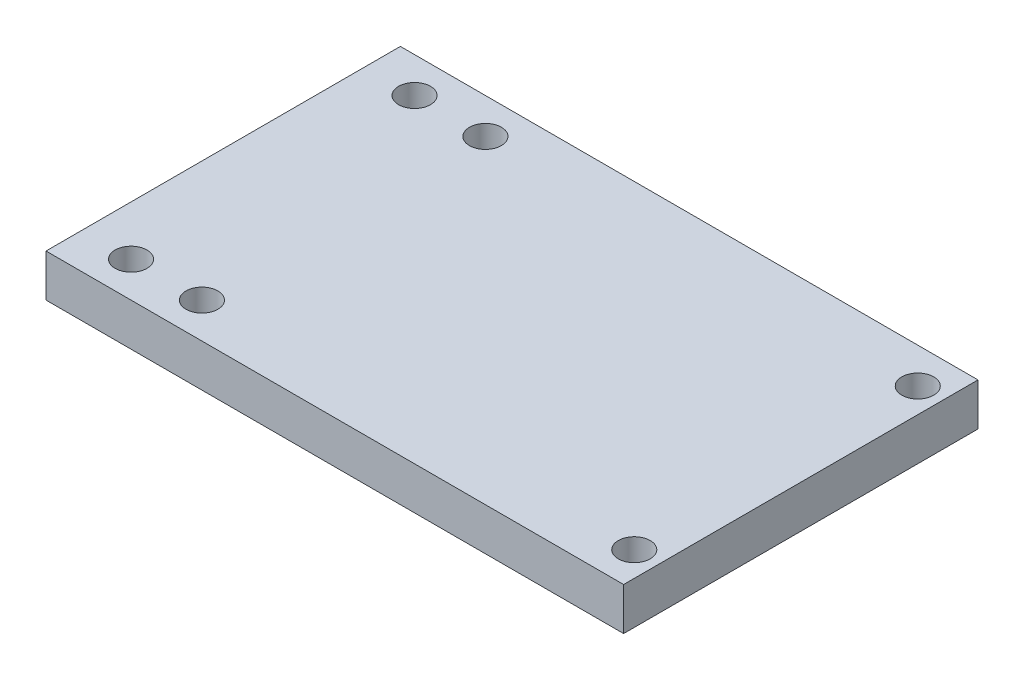
ISO-10303-21;
HEADER;
FILE_DESCRIPTION(('STEP AP214'),'2;1');
FILE_NAME('part.step','',(''),(''),'','','');
FILE_SCHEMA(('AUTOMOTIVE_DESIGN { 1 0 10303 214 1 1 1 1 }'));
ENDSEC;
DATA;
#1=APPLICATION_CONTEXT('core data for automotive mechanical design processes');
#2=APPLICATION_PROTOCOL_DEFINITION('international standard','automotive_design',2000,#1);
#3=PRODUCT_CONTEXT('',#1,'mechanical');
#4=PRODUCT('Part','Part','',(#3));
#5=PRODUCT_RELATED_PRODUCT_CATEGORY('part','',(#4));
#6=PRODUCT_DEFINITION_FORMATION('','',#4);
#7=PRODUCT_DEFINITION_CONTEXT('part definition',#1,'design');
#8=PRODUCT_DEFINITION('design','',#6,#7);
#9=PRODUCT_DEFINITION_SHAPE('','',#8);
#10=(LENGTH_UNIT() NAMED_UNIT(*) SI_UNIT(.MILLI.,.METRE.));
#11=(NAMED_UNIT(*) PLANE_ANGLE_UNIT() SI_UNIT($,.RADIAN.));
#12=(NAMED_UNIT(*) SI_UNIT($,.STERADIAN.) SOLID_ANGLE_UNIT());
#13=UNCERTAINTY_MEASURE_WITH_UNIT(LENGTH_MEASURE(1.E-05),#10,'distance_accuracy_value','');
#14=(GEOMETRIC_REPRESENTATION_CONTEXT(3) GLOBAL_UNCERTAINTY_ASSIGNED_CONTEXT((#13)) GLOBAL_UNIT_ASSIGNED_CONTEXT((#10,
#11,#12)) REPRESENTATION_CONTEXT('',''));
#15=CARTESIAN_POINT('',(0.,0.,0.));
#16=DIRECTION('',(0.,0.,1.));
#17=DIRECTION('',(1.,0.,0.));
#18=AXIS2_PLACEMENT_3D('',#15,#16,#17);
#19=CARTESIAN_POINT('',(0.,0.001600000000053,50.000049774017));
#20=DIRECTION('',(0.,1.,0.));
#21=DIRECTION('',(0.,0.,1.));
#22=AXIS2_PLACEMENT_3D('',#19,#20,#21);
#23=PLANE('',#22);
#24=CARTESIAN_POINT('',(78.,0.001600000000053,5.000049774017));
#25=DIRECTION('',(0.,1.,0.));
#26=DIRECTION('',(0.,0.,1.));
#27=AXIS2_PLACEMENT_3D('',#24,#25,#26);
#28=CIRCLE('',#27,2.25);
#29=CARTESIAN_POINT('',(78.,0.001600000000053,7.250049774017));
#30=VERTEX_POINT('',#29);
#31=EDGE_CURVE('E96',#30,#30,#28,.T.);
#32=ORIENTED_EDGE('',*,*,#31,.T.);
#33=EDGE_LOOP('',(#32));
#34=FACE_BOUND('',#33,.T.);
#35=CARTESIAN_POINT('',(17.,0.001600000000053,5.000049774017));
#36=DIRECTION('',(0.,1.,0.));
#37=DIRECTION('',(0.,0.,1.));
#38=AXIS2_PLACEMENT_3D('',#35,#36,#37);
#39=CIRCLE('',#38,2.25);
#40=CARTESIAN_POINT('',(17.,0.001600000000053,7.250049774017));
#41=VERTEX_POINT('',#40);
#42=EDGE_CURVE('E100',#41,#41,#39,.T.);
#43=ORIENTED_EDGE('',*,*,#42,.T.);
#44=EDGE_LOOP('',(#43));
#45=FACE_BOUND('',#44,.T.);
#46=CARTESIAN_POINT('',(7.,0.001600000000053,5.000049774017));
#47=DIRECTION('',(0.,1.,0.));
#48=DIRECTION('',(0.,0.,1.));
#49=AXIS2_PLACEMENT_3D('',#46,#47,#48);
#50=CIRCLE('',#49,2.25);
#51=CARTESIAN_POINT('',(7.,0.001600000000053,7.250049774017));
#52=VERTEX_POINT('',#51);
#53=EDGE_CURVE('E103',#52,#52,#50,.T.);
#54=ORIENTED_EDGE('',*,*,#53,.T.);
#55=EDGE_LOOP('',(#54));
#56=FACE_BOUND('',#55,.T.);
#57=CARTESIAN_POINT('',(78.,0.001600000000053,45.000049774017));
#58=DIRECTION('',(0.,1.,0.));
#59=DIRECTION('',(0.,0.,1.));
#60=AXIS2_PLACEMENT_3D('',#57,#58,#59);
#61=CIRCLE('',#60,2.25);
#62=CARTESIAN_POINT('',(78.,0.001600000000053,47.250049774017));
#63=VERTEX_POINT('',#62);
#64=EDGE_CURVE('E106',#63,#63,#61,.T.);
#65=ORIENTED_EDGE('',*,*,#64,.T.);
#66=EDGE_LOOP('',(#65));
#67=FACE_BOUND('',#66,.T.);
#68=CARTESIAN_POINT('',(17.,0.001600000000053,45.000049774017));
#69=DIRECTION('',(0.,1.,0.));
#70=DIRECTION('',(0.,0.,1.));
#71=AXIS2_PLACEMENT_3D('',#68,#69,#70);
#72=CIRCLE('',#71,2.25);
#73=CARTESIAN_POINT('',(17.,0.001600000000053,47.250049774017));
#74=VERTEX_POINT('',#73);
#75=EDGE_CURVE('E108',#74,#74,#72,.T.);
#76=ORIENTED_EDGE('',*,*,#75,.T.);
#77=EDGE_LOOP('',(#76));
#78=FACE_BOUND('',#77,.T.);
#79=CARTESIAN_POINT('',(7.,0.001600000000053,45.000049774017));
#80=DIRECTION('',(0.,1.,0.));
#81=DIRECTION('',(0.,0.,1.));
#82=AXIS2_PLACEMENT_3D('',#79,#80,#81);
#83=CIRCLE('',#82,2.25);
#84=CARTESIAN_POINT('',(7.,0.001600000000053,47.250049774017));
#85=VERTEX_POINT('',#84);
#86=EDGE_CURVE('E19',#85,#85,#83,.T.);
#87=ORIENTED_EDGE('',*,*,#86,.T.);
#88=EDGE_LOOP('',(#87));
#89=FACE_BOUND('',#88,.T.);
#90=DIRECTION('',(0.,0.,-1.));
#91=VECTOR('',#90,1.);
#92=CARTESIAN_POINT('',(81.5,0.001600000000053,50.000049774017));
#93=LINE('',#92,#91);
#94=CARTESIAN_POINT('',(81.5,0.001600000000053,50.000049774017));
#95=VERTEX_POINT('',#94);
#96=CARTESIAN_POINT('',(81.5,0.001600000000053,4.97740165887595E-05));
#97=VERTEX_POINT('',#96);
#98=EDGE_CURVE('E61',#95,#97,#93,.T.);
#99=ORIENTED_EDGE('',*,*,#98,.F.);
#100=DIRECTION('',(-1.,0.,0.));
#101=VECTOR('',#100,1.);
#102=CARTESIAN_POINT('',(0.,0.001600000000053,50.000049774017));
#103=LINE('',#102,#101);
#104=CARTESIAN_POINT('',(0.,0.001600000000053,50.000049774017));
#105=VERTEX_POINT('',#104);
#106=EDGE_CURVE('E55',#95,#105,#103,.T.);
#107=ORIENTED_EDGE('',*,*,#106,.T.);
#108=DIRECTION('',(0.,0.,-1.));
#109=VECTOR('',#108,1.);
#110=CARTESIAN_POINT('',(0.,0.001600000000053,50.000049774017));
#111=LINE('',#110,#109);
#112=CARTESIAN_POINT('',(0.,0.001600000000053,4.97740165887595E-05));
#113=VERTEX_POINT('',#112);
#114=EDGE_CURVE('E59',#105,#113,#111,.T.);
#115=ORIENTED_EDGE('',*,*,#114,.T.);
#116=DIRECTION('',(-1.,0.,0.));
#117=VECTOR('',#116,1.);
#118=CARTESIAN_POINT('',(0.,0.001600000000053,4.977401658834E-05));
#119=LINE('',#118,#117);
#120=EDGE_CURVE('E117',#97,#113,#119,.T.);
#121=ORIENTED_EDGE('',*,*,#120,.F.);
#122=EDGE_LOOP('',(#99,#107,#115,#121));
#123=FACE_BOUND('',#122,.T.);
#124=ADVANCED_FACE('F16',(#34,#45,#56,#67,#78,#89,#123),#23,.F.);
#125=CARTESIAN_POINT('',(0.,0.001600000000053,50.000049774017));
#126=DIRECTION('',(1.,0.,0.));
#127=DIRECTION('',(0.,0.,-1.));
#128=AXIS2_PLACEMENT_3D('',#125,#126,#127);
#129=PLANE('',#128);
#130=DIRECTION('',(0.,1.,0.));
#131=VECTOR('',#130,1.);
#132=CARTESIAN_POINT('',(0.,0.001600000000053,4.977401658834E-05));
#133=LINE('',#132,#131);
#134=CARTESIAN_POINT('',(0.,6.0016,4.97740165887595E-05));
#135=VERTEX_POINT('',#134);
#136=EDGE_CURVE('E69',#113,#135,#133,.T.);
#137=ORIENTED_EDGE('',*,*,#136,.F.);
#138=ORIENTED_EDGE('',*,*,#114,.F.);
#139=DIRECTION('',(0.,1.,0.));
#140=VECTOR('',#139,1.);
#141=CARTESIAN_POINT('',(0.,0.001600000000053,50.000049774017));
#142=LINE('',#141,#140);
#143=CARTESIAN_POINT('',(0.,6.0016,50.000049774017));
#144=VERTEX_POINT('',#143);
#145=EDGE_CURVE('E63',#105,#144,#142,.T.);
#146=ORIENTED_EDGE('',*,*,#145,.T.);
#147=DIRECTION('',(0.,0.,1.));
#148=VECTOR('',#147,1.);
#149=CARTESIAN_POINT('',(0.,6.0016,50.000049774017));
#150=LINE('',#149,#148);
#151=EDGE_CURVE('E99',#135,#144,#150,.T.);
#152=ORIENTED_EDGE('',*,*,#151,.F.);
#153=EDGE_LOOP('',(#137,#138,#146,#152));
#154=FACE_BOUND('',#153,.T.);
#155=ADVANCED_FACE('F66',(#154),#129,.F.);
#156=CARTESIAN_POINT('',(0.,0.001600000000053,50.000049774017));
#157=DIRECTION('',(0.,0.,-1.));
#158=DIRECTION('',(-1.,0.,0.));
#159=AXIS2_PLACEMENT_3D('',#156,#157,#158);
#160=PLANE('',#159);
#161=DIRECTION('',(1.,0.,0.));
#162=VECTOR('',#161,1.);
#163=CARTESIAN_POINT('',(0.,6.0016,50.000049774017));
#164=LINE('',#163,#162);
#165=CARTESIAN_POINT('',(81.5,6.0016,50.000049774017));
#166=VERTEX_POINT('',#165);
#167=EDGE_CURVE('E74',#144,#166,#164,.T.);
#168=ORIENTED_EDGE('',*,*,#167,.F.);
#169=ORIENTED_EDGE('',*,*,#145,.F.);
#170=ORIENTED_EDGE('',*,*,#106,.F.);
#171=DIRECTION('',(0.,1.,0.));
#172=VECTOR('',#171,1.);
#173=CARTESIAN_POINT('',(81.5,0.001600000000053,50.000049774017));
#174=LINE('',#173,#172);
#175=EDGE_CURVE('E76',#166,#95,#174,.F.);
#176=ORIENTED_EDGE('',*,*,#175,.F.);
#177=EDGE_LOOP('',(#168,#169,#170,#176));
#178=FACE_BOUND('',#177,.T.);
#179=ADVANCED_FACE('F72',(#178),#160,.F.);
#180=CARTESIAN_POINT('',(81.5,0.001600000000053,50.000049774017));
#181=DIRECTION('',(1.,0.,0.));
#182=DIRECTION('',(0.,0.,-1.));
#183=AXIS2_PLACEMENT_3D('',#180,#181,#182);
#184=PLANE('',#183);
#185=DIRECTION('',(0.,1.,0.));
#186=VECTOR('',#185,1.);
#187=CARTESIAN_POINT('',(81.5,0.001600000000053,4.977401658834E-05));
#188=LINE('',#187,#186);
#189=CARTESIAN_POINT('',(81.5,6.0016,4.97740165887595E-05));
#190=VERTEX_POINT('',#189);
#191=EDGE_CURVE('E34',#190,#97,#188,.F.);
#192=ORIENTED_EDGE('',*,*,#191,.F.);
#193=DIRECTION('',(0.,0.,1.));
#194=VECTOR('',#193,1.);
#195=CARTESIAN_POINT('',(81.5,6.0016,50.000049774017));
#196=LINE('',#195,#194);
#197=EDGE_CURVE('E124',#166,#190,#196,.F.);
#198=ORIENTED_EDGE('',*,*,#197,.F.);
#199=ORIENTED_EDGE('',*,*,#175,.T.);
#200=ORIENTED_EDGE('',*,*,#98,.T.);
#201=EDGE_LOOP('',(#192,#198,#199,#200));
#202=FACE_BOUND('',#201,.T.);
#203=ADVANCED_FACE('F122',(#202),#184,.T.);
#204=CARTESIAN_POINT('',(0.,0.001600000000053,4.977401658834E-05));
#205=DIRECTION('',(0.,0.,-1.));
#206=DIRECTION('',(-1.,0.,0.));
#207=AXIS2_PLACEMENT_3D('',#204,#205,#206);
#208=PLANE('',#207);
#209=DIRECTION('',(1.,0.,0.));
#210=VECTOR('',#209,1.);
#211=CARTESIAN_POINT('',(0.,6.0016,4.97740165888994E-05));
#212=LINE('',#211,#210);
#213=EDGE_CURVE('E95',#190,#135,#212,.F.);
#214=ORIENTED_EDGE('',*,*,#213,.F.);
#215=ORIENTED_EDGE('',*,*,#191,.T.);
#216=ORIENTED_EDGE('',*,*,#120,.T.);
#217=ORIENTED_EDGE('',*,*,#136,.T.);
#218=EDGE_LOOP('',(#214,#215,#216,#217));
#219=FACE_BOUND('',#218,.T.);
#220=ADVANCED_FACE('F130',(#219),#208,.T.);
#221=CARTESIAN_POINT('',(7.,0.001600000000053,45.000049774017));
#222=DIRECTION('',(0.,1.,0.));
#223=DIRECTION('',(0.,0.,1.));
#224=AXIS2_PLACEMENT_3D('',#221,#222,#223);
#225=CYLINDRICAL_SURFACE('',#224,2.25);
#226=ORIENTED_EDGE('',*,*,#86,.F.);
#227=EDGE_LOOP('',(#226));
#228=FACE_BOUND('',#227,.T.);
#229=CARTESIAN_POINT('',(7.,6.0016,45.000049774017));
#230=DIRECTION('',(0.,1.,0.));
#231=DIRECTION('',(0.,0.,1.));
#232=AXIS2_PLACEMENT_3D('',#229,#230,#231);
#233=CIRCLE('',#232,2.25);
#234=CARTESIAN_POINT('',(7.,6.0016,47.250049774017));
#235=VERTEX_POINT('',#234);
#236=EDGE_CURVE('E92',#235,#235,#233,.F.);
#237=ORIENTED_EDGE('',*,*,#236,.F.);
#238=EDGE_LOOP('',(#237));
#239=FACE_BOUND('',#238,.T.);
#240=ADVANCED_FACE('F132',(#228,#239),#225,.F.);
#241=CARTESIAN_POINT('',(17.,0.001600000000053,45.000049774017));
#242=DIRECTION('',(0.,1.,0.));
#243=DIRECTION('',(0.,0.,1.));
#244=AXIS2_PLACEMENT_3D('',#241,#242,#243);
#245=CYLINDRICAL_SURFACE('',#244,2.25);
#246=ORIENTED_EDGE('',*,*,#75,.F.);
#247=EDGE_LOOP('',(#246));
#248=FACE_BOUND('',#247,.T.);
#249=CARTESIAN_POINT('',(17.,6.0016,45.000049774017));
#250=DIRECTION('',(0.,1.,0.));
#251=DIRECTION('',(0.,0.,1.));
#252=AXIS2_PLACEMENT_3D('',#249,#250,#251);
#253=CIRCLE('',#252,2.25);
#254=CARTESIAN_POINT('',(17.,6.0016,47.250049774017));
#255=VERTEX_POINT('',#254);
#256=EDGE_CURVE('E89',#255,#255,#253,.F.);
#257=ORIENTED_EDGE('',*,*,#256,.F.);
#258=EDGE_LOOP('',(#257));
#259=FACE_BOUND('',#258,.T.);
#260=ADVANCED_FACE('F139',(#248,#259),#245,.F.);
#261=CARTESIAN_POINT('',(78.,0.001600000000053,45.000049774017));
#262=DIRECTION('',(0.,1.,0.));
#263=DIRECTION('',(0.,0.,1.));
#264=AXIS2_PLACEMENT_3D('',#261,#262,#263);
#265=CYLINDRICAL_SURFACE('',#264,2.25);
#266=ORIENTED_EDGE('',*,*,#64,.F.);
#267=EDGE_LOOP('',(#266));
#268=FACE_BOUND('',#267,.T.);
#269=CARTESIAN_POINT('',(78.,6.0016,45.000049774017));
#270=DIRECTION('',(0.,1.,0.));
#271=DIRECTION('',(0.,0.,1.));
#272=AXIS2_PLACEMENT_3D('',#269,#270,#271);
#273=CIRCLE('',#272,2.25);
#274=CARTESIAN_POINT('',(78.,6.0016,47.250049774017));
#275=VERTEX_POINT('',#274);
#276=EDGE_CURVE('E86',#275,#275,#273,.F.);
#277=ORIENTED_EDGE('',*,*,#276,.F.);
#278=EDGE_LOOP('',(#277));
#279=FACE_BOUND('',#278,.T.);
#280=ADVANCED_FACE('F161',(#268,#279),#265,.F.);
#281=CARTESIAN_POINT('',(7.,0.001600000000053,5.000049774017));
#282=DIRECTION('',(0.,1.,0.));
#283=DIRECTION('',(0.,0.,1.));
#284=AXIS2_PLACEMENT_3D('',#281,#282,#283);
#285=CYLINDRICAL_SURFACE('',#284,2.25);
#286=ORIENTED_EDGE('',*,*,#53,.F.);
#287=EDGE_LOOP('',(#286));
#288=FACE_BOUND('',#287,.T.);
#289=CARTESIAN_POINT('',(7.,6.0016,5.000049774017));
#290=DIRECTION('',(0.,1.,0.));
#291=DIRECTION('',(0.,0.,1.));
#292=AXIS2_PLACEMENT_3D('',#289,#290,#291);
#293=CIRCLE('',#292,2.25);
#294=CARTESIAN_POINT('',(7.,6.0016,7.250049774017));
#295=VERTEX_POINT('',#294);
#296=EDGE_CURVE('E83',#295,#295,#293,.F.);
#297=ORIENTED_EDGE('',*,*,#296,.F.);
#298=EDGE_LOOP('',(#297));
#299=FACE_BOUND('',#298,.T.);
#300=ADVANCED_FACE('F157',(#288,#299),#285,.F.);
#301=CARTESIAN_POINT('',(17.,0.001600000000053,5.000049774017));
#302=DIRECTION('',(0.,1.,0.));
#303=DIRECTION('',(0.,0.,1.));
#304=AXIS2_PLACEMENT_3D('',#301,#302,#303);
#305=CYLINDRICAL_SURFACE('',#304,2.25);
#306=ORIENTED_EDGE('',*,*,#42,.F.);
#307=EDGE_LOOP('',(#306));
#308=FACE_BOUND('',#307,.T.);
#309=CARTESIAN_POINT('',(17.,6.0016,5.000049774017));
#310=DIRECTION('',(0.,1.,0.));
#311=DIRECTION('',(0.,0.,1.));
#312=AXIS2_PLACEMENT_3D('',#309,#310,#311);
#313=CIRCLE('',#312,2.25);
#314=CARTESIAN_POINT('',(17.,6.0016,7.250049774017));
#315=VERTEX_POINT('',#314);
#316=EDGE_CURVE('E25',#315,#315,#313,.F.);
#317=ORIENTED_EDGE('',*,*,#316,.F.);
#318=EDGE_LOOP('',(#317));
#319=FACE_BOUND('',#318,.T.);
#320=ADVANCED_FACE('F150',(#308,#319),#305,.F.);
#321=CARTESIAN_POINT('',(78.,0.001600000000053,5.000049774017));
#322=DIRECTION('',(0.,1.,0.));
#323=DIRECTION('',(0.,0.,1.));
#324=AXIS2_PLACEMENT_3D('',#321,#322,#323);
#325=CYLINDRICAL_SURFACE('',#324,2.25);
#326=ORIENTED_EDGE('',*,*,#31,.F.);
#327=EDGE_LOOP('',(#326));
#328=FACE_BOUND('',#327,.T.);
#329=CARTESIAN_POINT('',(78.,6.0016,5.000049774017));
#330=DIRECTION('',(0.,1.,0.));
#331=DIRECTION('',(0.,0.,1.));
#332=AXIS2_PLACEMENT_3D('',#329,#330,#331);
#333=CIRCLE('',#332,2.25);
#334=CARTESIAN_POINT('',(78.,6.0016,7.250049774017));
#335=VERTEX_POINT('',#334);
#336=EDGE_CURVE('E11',#335,#335,#333,.F.);
#337=ORIENTED_EDGE('',*,*,#336,.F.);
#338=EDGE_LOOP('',(#337));
#339=FACE_BOUND('',#338,.T.);
#340=ADVANCED_FACE('F144',(#328,#339),#325,.F.);
#341=CARTESIAN_POINT('',(0.,6.0016,50.000049774017));
#342=DIRECTION('',(0.,1.,0.));
#343=DIRECTION('',(0.,0.,1.));
#344=AXIS2_PLACEMENT_3D('',#341,#342,#343);
#345=PLANE('',#344);
#346=ORIENTED_EDGE('',*,*,#336,.T.);
#347=EDGE_LOOP('',(#346));
#348=FACE_BOUND('',#347,.T.);
#349=ORIENTED_EDGE('',*,*,#316,.T.);
#350=EDGE_LOOP('',(#349));
#351=FACE_BOUND('',#350,.T.);
#352=ORIENTED_EDGE('',*,*,#296,.T.);
#353=EDGE_LOOP('',(#352));
#354=FACE_BOUND('',#353,.T.);
#355=ORIENTED_EDGE('',*,*,#276,.T.);
#356=EDGE_LOOP('',(#355));
#357=FACE_BOUND('',#356,.T.);
#358=ORIENTED_EDGE('',*,*,#256,.T.);
#359=EDGE_LOOP('',(#358));
#360=FACE_BOUND('',#359,.T.);
#361=ORIENTED_EDGE('',*,*,#236,.T.);
#362=EDGE_LOOP('',(#361));
#363=FACE_BOUND('',#362,.T.);
#364=ORIENTED_EDGE('',*,*,#197,.T.);
#365=ORIENTED_EDGE('',*,*,#213,.T.);
#366=ORIENTED_EDGE('',*,*,#151,.T.);
#367=ORIENTED_EDGE('',*,*,#167,.T.);
#368=EDGE_LOOP('',(#364,#365,#366,#367));
#369=FACE_BOUND('',#368,.T.);
#370=ADVANCED_FACE('F128',(#348,#351,#354,#357,#360,#363,#369),#345,.T.);
#371=CLOSED_SHELL('',(#124,#155,#179,#203,#220,#240,#260,#280,#300,#320,#340,#370));
#372=MANIFOLD_SOLID_BREP('B1',#371);
#373=ADVANCED_BREP_SHAPE_REPRESENTATION('',(#18,#372),#14);
#374=SHAPE_DEFINITION_REPRESENTATION(#9,#373);
ENDSEC;
END-ISO-10303-21;
